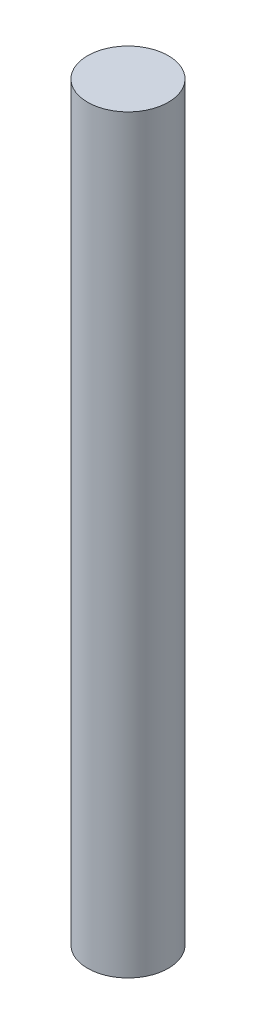
ISO-10303-21;
HEADER;
FILE_DESCRIPTION(('STEP AP214'),'2;1');
FILE_NAME('part.step','',(''),(''),'','','');
FILE_SCHEMA(('AUTOMOTIVE_DESIGN { 1 0 10303 214 1 1 1 1 }'));
ENDSEC;
DATA;
#1=APPLICATION_CONTEXT('core data for automotive mechanical design processes');
#2=APPLICATION_PROTOCOL_DEFINITION('international standard','automotive_design',2000,#1);
#3=PRODUCT_CONTEXT('',#1,'mechanical');
#4=PRODUCT('Part','Part','',(#3));
#5=PRODUCT_RELATED_PRODUCT_CATEGORY('part','',(#4));
#6=PRODUCT_DEFINITION_FORMATION('','',#4);
#7=PRODUCT_DEFINITION_CONTEXT('part definition',#1,'design');
#8=PRODUCT_DEFINITION('design','',#6,#7);
#9=PRODUCT_DEFINITION_SHAPE('','',#8);
#10=(LENGTH_UNIT() NAMED_UNIT(*) SI_UNIT(.MILLI.,.METRE.));
#11=(NAMED_UNIT(*) PLANE_ANGLE_UNIT() SI_UNIT($,.RADIAN.));
#12=(NAMED_UNIT(*) SI_UNIT($,.STERADIAN.) SOLID_ANGLE_UNIT());
#13=UNCERTAINTY_MEASURE_WITH_UNIT(LENGTH_MEASURE(1.E-05),#10,'distance_accuracy_value','');
#14=(GEOMETRIC_REPRESENTATION_CONTEXT(3) GLOBAL_UNCERTAINTY_ASSIGNED_CONTEXT((#13)) GLOBAL_UNIT_ASSIGNED_CONTEXT((#10,
#11,#12)) REPRESENTATION_CONTEXT('',''));
#15=CARTESIAN_POINT('',(0.,0.,0.));
#16=DIRECTION('',(0.,0.,1.));
#17=DIRECTION('',(1.,0.,0.));
#18=AXIS2_PLACEMENT_3D('',#15,#16,#17);
#19=CARTESIAN_POINT('',(0.,1000.,0.));
#20=DIRECTION('',(0.,-1.,0.));
#21=DIRECTION('',(0.,0.,-1.));
#22=AXIS2_PLACEMENT_3D('',#19,#20,#21);
#23=CYLINDRICAL_SURFACE('',#22,53.8172985196585);
#24=CARTESIAN_POINT('',(0.,1000.,0.));
#25=DIRECTION('',(0.,1.,0.));
#26=DIRECTION('',(0.,0.,1.));
#27=AXIS2_PLACEMENT_3D('',#24,#25,#26);
#28=CIRCLE('',#27,53.8172985196585);
#29=CARTESIAN_POINT('',(0.,1000.,53.8172985196585));
#30=VERTEX_POINT('',#29);
#31=EDGE_CURVE('E10',#30,#30,#28,.T.);
#32=ORIENTED_EDGE('',*,*,#31,.F.);
#33=EDGE_LOOP('',(#32));
#34=FACE_BOUND('',#33,.T.);
#35=CARTESIAN_POINT('',(0.,0.,0.));
#36=DIRECTION('',(0.,1.,0.));
#37=DIRECTION('',(0.,0.,1.));
#38=AXIS2_PLACEMENT_3D('',#35,#36,#37);
#39=CIRCLE('',#38,53.8172985196585);
#40=CARTESIAN_POINT('',(0.,0.,53.8172985196585));
#41=VERTEX_POINT('',#40);
#42=EDGE_CURVE('E44',#41,#41,#39,.T.);
#43=ORIENTED_EDGE('',*,*,#42,.T.);
#44=EDGE_LOOP('',(#43));
#45=FACE_BOUND('',#44,.T.);
#46=ADVANCED_FACE('F41',(#34,#45),#23,.T.);
#47=CARTESIAN_POINT('',(0.,1000.,0.));
#48=DIRECTION('',(0.,1.,0.));
#49=DIRECTION('',(0.,0.,1.));
#50=AXIS2_PLACEMENT_3D('',#47,#48,#49);
#51=PLANE('',#50);
#52=ORIENTED_EDGE('',*,*,#31,.T.);
#53=EDGE_LOOP('',(#52));
#54=FACE_BOUND('',#53,.T.);
#55=ADVANCED_FACE('F58',(#54),#51,.T.);
#56=CARTESIAN_POINT('',(0.,0.,0.));
#57=DIRECTION('',(0.,1.,0.));
#58=DIRECTION('',(0.,0.,1.));
#59=AXIS2_PLACEMENT_3D('',#56,#57,#58);
#60=PLANE('',#59);
#61=ORIENTED_EDGE('',*,*,#42,.F.);
#62=EDGE_LOOP('',(#61));
#63=FACE_BOUND('',#62,.T.);
#64=ADVANCED_FACE('F56',(#63),#60,.F.);
#65=CLOSED_SHELL('',(#46,#55,#64));
#66=MANIFOLD_SOLID_BREP('B2',#65);
#67=ADVANCED_BREP_SHAPE_REPRESENTATION('',(#18,#66),#14);
#68=SHAPE_DEFINITION_REPRESENTATION(#9,#67);
ENDSEC;
END-ISO-10303-21;
